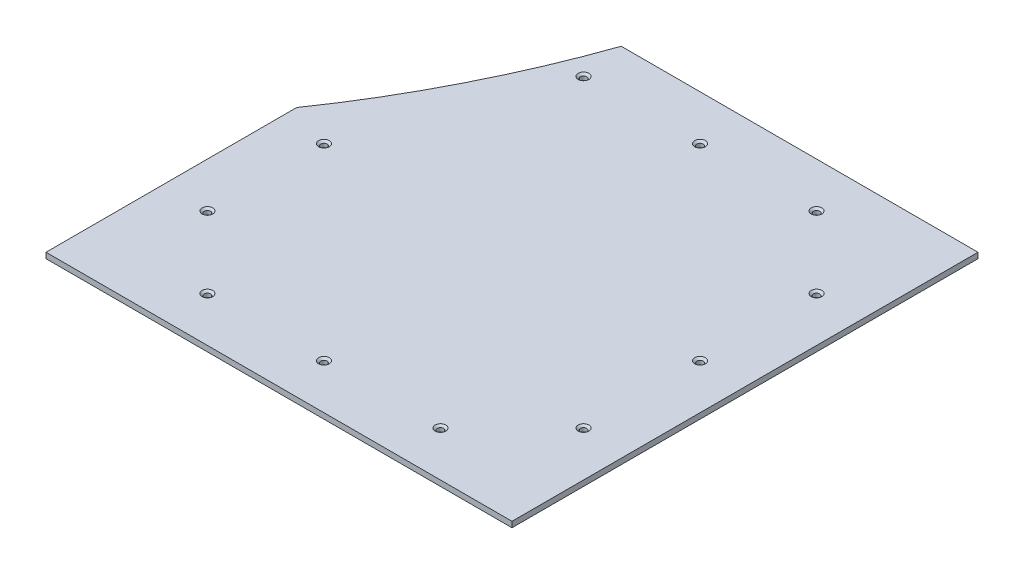
ISO-10303-21;
HEADER;
FILE_DESCRIPTION(('STEP AP214'),'2;1');
FILE_NAME('part.step','',(''),(''),'','','');
FILE_SCHEMA(('AUTOMOTIVE_DESIGN { 1 0 10303 214 1 1 1 1 }'));
ENDSEC;
DATA;
#1=APPLICATION_CONTEXT('core data for automotive mechanical design processes');
#2=APPLICATION_PROTOCOL_DEFINITION('international standard','automotive_design',2000,#1);
#3=PRODUCT_CONTEXT('',#1,'mechanical');
#4=PRODUCT('Part','Part','',(#3));
#5=PRODUCT_RELATED_PRODUCT_CATEGORY('part','',(#4));
#6=PRODUCT_DEFINITION_FORMATION('','',#4);
#7=PRODUCT_DEFINITION_CONTEXT('part definition',#1,'design');
#8=PRODUCT_DEFINITION('design','',#6,#7);
#9=PRODUCT_DEFINITION_SHAPE('','',#8);
#10=(LENGTH_UNIT() NAMED_UNIT(*) SI_UNIT(.MILLI.,.METRE.));
#11=(NAMED_UNIT(*) PLANE_ANGLE_UNIT() SI_UNIT($,.RADIAN.));
#12=(NAMED_UNIT(*) SI_UNIT($,.STERADIAN.) SOLID_ANGLE_UNIT());
#13=UNCERTAINTY_MEASURE_WITH_UNIT(LENGTH_MEASURE(1.E-05),#10,'distance_accuracy_value','');
#14=(GEOMETRIC_REPRESENTATION_CONTEXT(3) GLOBAL_UNCERTAINTY_ASSIGNED_CONTEXT((#13)) GLOBAL_UNIT_ASSIGNED_CONTEXT((#10,
#11,#12)) REPRESENTATION_CONTEXT('',''));
#15=CARTESIAN_POINT('',(0.,0.,0.));
#16=DIRECTION('',(0.,0.,1.));
#17=DIRECTION('',(1.,0.,0.));
#18=AXIS2_PLACEMENT_3D('',#15,#16,#17);
#19=CARTESIAN_POINT('',(65.821179,76.933679,65.821179));
#20=DIRECTION('',(1.,0.,0.));
#21=DIRECTION('',(0.,0.,1.));
#22=AXIS2_PLACEMENT_3D('',#19,#20,#21);
#23=PLANE('',#22);
#24=DIRECTION('',(0.,0.,1.));
#25=VECTOR('',#24,1.);
#26=CARTESIAN_POINT('',(65.821179,75.346179,65.821179));
#27=LINE('',#26,#25);
#28=CARTESIAN_POINT('',(65.821179,75.346179,-65.821179));
#29=VERTEX_POINT('',#28);
#30=CARTESIAN_POINT('',(65.821179,75.346179,65.821179));
#31=VERTEX_POINT('',#30);
#32=EDGE_CURVE('E103',#29,#31,#27,.T.);
#33=ORIENTED_EDGE('',*,*,#32,.F.);
#34=DIRECTION('',(0.,-1.,0.));
#35=VECTOR('',#34,1.);
#36=CARTESIAN_POINT('',(65.821179,76.933679,-65.821179));
#37=LINE('',#36,#35);
#38=CARTESIAN_POINT('',(65.821179,76.933679,-65.821179));
#39=VERTEX_POINT('',#38);
#40=EDGE_CURVE('E39',#39,#29,#37,.T.);
#41=ORIENTED_EDGE('',*,*,#40,.F.);
#42=DIRECTION('',(0.,0.,1.));
#43=VECTOR('',#42,1.);
#44=CARTESIAN_POINT('',(65.821179,76.933679,65.821179));
#45=LINE('',#44,#43);
#46=CARTESIAN_POINT('',(65.821179,76.933679,65.821179));
#47=VERTEX_POINT('',#46);
#48=EDGE_CURVE('E101',#39,#47,#45,.T.);
#49=ORIENTED_EDGE('',*,*,#48,.T.);
#50=DIRECTION('',(0.,-1.,0.));
#51=VECTOR('',#50,1.);
#52=CARTESIAN_POINT('',(65.821179,76.933679,65.821179));
#53=LINE('',#52,#51);
#54=EDGE_CURVE('E76',#47,#31,#53,.T.);
#55=ORIENTED_EDGE('',*,*,#54,.T.);
#56=EDGE_LOOP('',(#33,#41,#49,#55));
#57=FACE_BOUND('',#56,.T.);
#58=ADVANCED_FACE('F32',(#57),#23,.T.);
#59=CARTESIAN_POINT('',(65.821179,76.933679,-65.821179));
#60=DIRECTION('',(0.,0.,-1.));
#61=DIRECTION('',(1.,0.,0.));
#62=AXIS2_PLACEMENT_3D('',#59,#60,#61);
#63=PLANE('',#62);
#64=CARTESIAN_POINT('',(-82.3805879925049,72.1938508100711,-65.821179));
#65=DIRECTION('',(0.,0.,-1.));
#66=DIRECTION('',(-0.698196395740358,0.715906273876108,0.));
#67=AXIS2_PLACEMENT_3D('',#64,#65,#66);
#68=ELLIPSE('',#67,54.4366628705828,44.45);
#69=CARTESIAN_POINT('',(-34.97366248008,76.933679,-65.821179));
#70=VERTEX_POINT('',#69);
#71=CARTESIAN_POINT('',(-34.5349416414305,75.346179,-65.821179));
#72=VERTEX_POINT('',#71);
#73=EDGE_CURVE('E46',#70,#72,#68,.T.);
#74=ORIENTED_EDGE('',*,*,#73,.F.);
#75=DIRECTION('',(1.,0.,0.));
#76=VECTOR('',#75,1.);
#77=CARTESIAN_POINT('',(65.821179,76.933679,-65.821179));
#78=LINE('',#77,#76);
#79=EDGE_CURVE('E53',#70,#39,#78,.T.);
#80=ORIENTED_EDGE('',*,*,#79,.T.);
#81=ORIENTED_EDGE('',*,*,#40,.T.);
#82=DIRECTION('',(1.,0.,0.));
#83=VECTOR('',#82,1.);
#84=CARTESIAN_POINT('',(65.821179,75.346179,-65.821179));
#85=LINE('',#84,#83);
#86=EDGE_CURVE('E71',#72,#29,#85,.T.);
#87=ORIENTED_EDGE('',*,*,#86,.F.);
#88=EDGE_LOOP('',(#74,#80,#81,#87));
#89=FACE_BOUND('',#88,.T.);
#90=ADVANCED_FACE('F132',(#89),#63,.T.);
#91=CARTESIAN_POINT('',(-65.821179,76.933679,65.821179));
#92=DIRECTION('',(-1.,0.,0.));
#93=DIRECTION('',(0.,0.,-1.));
#94=AXIS2_PLACEMENT_3D('',#91,#92,#93);
#95=PLANE('',#94);
#96=CARTESIAN_POINT('',(-65.821179,55.2144094068485,-99.3686619114966));
#97=DIRECTION('',(-1.,0.,0.));
#98=DIRECTION('',(0.,0.451584874767388,0.892228166379723));
#99=AXIS2_PLACEMENT_3D('',#96,#97,#98);
#100=ELLIPSE('',#99,110.282499709764,44.45);
#101=CARTESIAN_POINT('',(-65.821179,75.346179,-5.93497246907813));
#102=VERTEX_POINT('',#101);
#103=CARTESIAN_POINT('',(-65.821179,76.933679,-4.99570311764791));
#104=VERTEX_POINT('',#103);
#105=EDGE_CURVE('E86',#102,#104,#100,.T.);
#106=ORIENTED_EDGE('',*,*,#105,.F.);
#107=DIRECTION('',(0.,0.,-1.));
#108=VECTOR('',#107,1.);
#109=CARTESIAN_POINT('',(-65.821179,75.346179,65.821179));
#110=LINE('',#109,#108);
#111=CARTESIAN_POINT('',(-65.821179,75.346179,65.821179));
#112=VERTEX_POINT('',#111);
#113=EDGE_CURVE('E93',#112,#102,#110,.T.);
#114=ORIENTED_EDGE('',*,*,#113,.F.);
#115=DIRECTION('',(0.,-1.,0.));
#116=VECTOR('',#115,1.);
#117=CARTESIAN_POINT('',(-65.821179,76.933679,65.821179));
#118=LINE('',#117,#116);
#119=CARTESIAN_POINT('',(-65.821179,76.933679,65.821179));
#120=VERTEX_POINT('',#119);
#121=EDGE_CURVE('E108',#120,#112,#118,.T.);
#122=ORIENTED_EDGE('',*,*,#121,.F.);
#123=DIRECTION('',(0.,0.,-1.));
#124=VECTOR('',#123,1.);
#125=CARTESIAN_POINT('',(-65.821179,76.933679,65.821179));
#126=LINE('',#125,#124);
#127=EDGE_CURVE('E96',#120,#104,#126,.T.);
#128=ORIENTED_EDGE('',*,*,#127,.T.);
#129=EDGE_LOOP('',(#106,#114,#122,#128));
#130=FACE_BOUND('',#129,.T.);
#131=ADVANCED_FACE('F92',(#130),#95,.T.);
#132=CARTESIAN_POINT('',(65.821179,76.933679,65.821179));
#133=DIRECTION('',(0.,0.,1.));
#134=DIRECTION('',(-1.,0.,0.));
#135=AXIS2_PLACEMENT_3D('',#132,#133,#134);
#136=PLANE('',#135);
#137=DIRECTION('',(-1.,0.,0.));
#138=VECTOR('',#137,1.);
#139=CARTESIAN_POINT('',(65.821179,75.346179,65.821179));
#140=LINE('',#139,#138);
#141=EDGE_CURVE('E99',#31,#112,#140,.T.);
#142=ORIENTED_EDGE('',*,*,#141,.F.);
#143=ORIENTED_EDGE('',*,*,#54,.F.);
#144=DIRECTION('',(-1.,0.,0.));
#145=VECTOR('',#144,1.);
#146=CARTESIAN_POINT('',(65.821179,76.933679,65.821179));
#147=LINE('',#146,#145);
#148=EDGE_CURVE('E113',#47,#120,#147,.T.);
#149=ORIENTED_EDGE('',*,*,#148,.T.);
#150=ORIENTED_EDGE('',*,*,#121,.T.);
#151=EDGE_LOOP('',(#142,#143,#149,#150));
#152=FACE_BOUND('',#151,.T.);
#153=ADVANCED_FACE('F127',(#152),#136,.T.);
#154=CARTESIAN_POINT('',(65.821179,76.933679,-65.821179));
#155=DIRECTION('',(0.,1.,0.));
#156=DIRECTION('',(0.,0.,-1.));
#157=AXIS2_PLACEMENT_3D('',#154,#155,#156);
#158=PLANE('',#157);
#159=CARTESIAN_POINT('',(-87.0031637114175,76.933679,-56.4563653156764));
#160=DIRECTION('',(0.,1.,0.));
#161=DIRECTION('',(-0.442624526559217,0.,0.896707047194472));
#162=AXIS2_PLACEMENT_3D('',#159,#160,#161);
#163=ELLIPSE('',#162,107.554363776842,44.45);
#164=EDGE_CURVE('E133',#104,#70,#163,.T.);
#165=ORIENTED_EDGE('',*,*,#164,.F.);
#166=ORIENTED_EDGE('',*,*,#127,.F.);
#167=ORIENTED_EDGE('',*,*,#148,.F.);
#168=ORIENTED_EDGE('',*,*,#48,.F.);
#169=ORIENTED_EDGE('',*,*,#79,.F.);
#170=EDGE_LOOP('',(#165,#166,#167,#168,#169));
#171=FACE_BOUND('',#170,.T.);
#172=CARTESIAN_POINT('',(-53.1211790000003,76.933679,32.9105894999995));
#173=DIRECTION('',(0.,1.,0.));
#174=DIRECTION('',(0.,0.,-1.));
#175=AXIS2_PLACEMENT_3D('',#172,#173,#174);
#176=CIRCLE('',#175,1.5113);
#177=CARTESIAN_POINT('',(-53.1211790000003,76.933679,31.3992894999995));
#178=VERTEX_POINT('',#177);
#179=EDGE_CURVE('E135',#178,#178,#176,.T.);
#180=ORIENTED_EDGE('',*,*,#179,.F.);
#181=EDGE_LOOP('',(#180));
#182=FACE_BOUND('',#181,.T.);
#183=CARTESIAN_POINT('',(-53.121179,76.933679,-5.54508773728232E-13));
#184=DIRECTION('',(0.,1.,0.));
#185=DIRECTION('',(0.,0.,-1.));
#186=AXIS2_PLACEMENT_3D('',#183,#184,#185);
#187=CIRCLE('',#186,1.5113);
#188=CARTESIAN_POINT('',(-53.121179,76.933679,-1.51130000000055));
#189=VERTEX_POINT('',#188);
#190=EDGE_CURVE('E146',#189,#189,#187,.T.);
#191=ORIENTED_EDGE('',*,*,#190,.F.);
#192=EDGE_LOOP('',(#191));
#193=FACE_BOUND('',#192,.T.);
#194=CARTESIAN_POINT('',(32.9105894999996,76.933679,53.1211790000002));
#195=DIRECTION('',(0.,1.,0.));
#196=DIRECTION('',(0.,0.,-1.));
#197=AXIS2_PLACEMENT_3D('',#194,#195,#196);
#198=CIRCLE('',#197,1.5113);
#199=CARTESIAN_POINT('',(32.9105894999996,76.933679,51.6098790000002));
#200=VERTEX_POINT('',#199);
#201=EDGE_CURVE('E155',#200,#200,#198,.T.);
#202=ORIENTED_EDGE('',*,*,#201,.F.);
#203=EDGE_LOOP('',(#202));
#204=FACE_BOUND('',#203,.T.);
#205=CARTESIAN_POINT('',(-3.69037061127219E-13,76.933679,53.121179));
#206=DIRECTION('',(0.,1.,0.));
#207=DIRECTION('',(0.,0.,-1.));
#208=AXIS2_PLACEMENT_3D('',#205,#206,#207);
#209=CIRCLE('',#208,1.5113);
#210=CARTESIAN_POINT('',(-3.69037061127219E-13,76.933679,51.609879));
#211=VERTEX_POINT('',#210);
#212=EDGE_CURVE('E164',#211,#211,#209,.T.);
#213=ORIENTED_EDGE('',*,*,#212,.F.);
#214=EDGE_LOOP('',(#213));
#215=FACE_BOUND('',#214,.T.);
#216=CARTESIAN_POINT('',(-32.9105895000004,76.933679,53.1211789999997));
#217=DIRECTION('',(0.,1.,0.));
#218=DIRECTION('',(0.,0.,-1.));
#219=AXIS2_PLACEMENT_3D('',#216,#217,#218);
#220=CIRCLE('',#219,1.5113);
#221=CARTESIAN_POINT('',(-32.9105895000004,76.933679,51.6098789999997));
#222=VERTEX_POINT('',#221);
#223=EDGE_CURVE('E173',#222,#222,#220,.T.);
#224=ORIENTED_EDGE('',*,*,#223,.F.);
#225=EDGE_LOOP('',(#224));
#226=FACE_BOUND('',#225,.T.);
#227=CARTESIAN_POINT('',(53.1211790000001,76.933679,-32.9105894999998));
#228=DIRECTION('',(0.,1.,0.));
#229=DIRECTION('',(0.,0.,-1.));
#230=AXIS2_PLACEMENT_3D('',#227,#228,#229);
#231=CIRCLE('',#230,1.5113);
#232=CARTESIAN_POINT('',(53.1211790000001,76.933679,-34.4218894999998));
#233=VERTEX_POINT('',#232);
#234=EDGE_CURVE('E182',#233,#233,#231,.T.);
#235=ORIENTED_EDGE('',*,*,#234,.F.);
#236=EDGE_LOOP('',(#235));
#237=FACE_BOUND('',#236,.T.);
#238=CARTESIAN_POINT('',(53.121179,76.933679,1.83565348526206E-13));
#239=DIRECTION('',(0.,1.,0.));
#240=DIRECTION('',(0.,0.,-1.));
#241=AXIS2_PLACEMENT_3D('',#238,#239,#240);
#242=CIRCLE('',#241,1.5113);
#243=CARTESIAN_POINT('',(53.121179,76.933679,-1.51129999999982));
#244=VERTEX_POINT('',#243);
#245=EDGE_CURVE('E191',#244,#244,#242,.T.);
#246=ORIENTED_EDGE('',*,*,#245,.F.);
#247=EDGE_LOOP('',(#246));
#248=FACE_BOUND('',#247,.T.);
#249=CARTESIAN_POINT('',(53.1211789999998,76.933679,32.9105895000002));
#250=DIRECTION('',(0.,1.,0.));
#251=DIRECTION('',(0.,0.,-1.));
#252=AXIS2_PLACEMENT_3D('',#249,#250,#251);
#253=CIRCLE('',#252,1.5113);
#254=CARTESIAN_POINT('',(53.1211789999998,76.933679,31.3992895000002));
#255=VERTEX_POINT('',#254);
#256=EDGE_CURVE('E200',#255,#255,#253,.T.);
#257=ORIENTED_EDGE('',*,*,#256,.F.);
#258=EDGE_LOOP('',(#257));
#259=FACE_BOUND('',#258,.T.);
#260=CARTESIAN_POINT('',(-32.9105895,76.933679,-53.121179));
#261=DIRECTION('',(0.,1.,0.));
#262=DIRECTION('',(0.,0.,-1.));
#263=AXIS2_PLACEMENT_3D('',#260,#261,#262);
#264=CIRCLE('',#263,1.5113);
#265=CARTESIAN_POINT('',(-32.9105895,76.933679,-54.632479));
#266=VERTEX_POINT('',#265);
#267=EDGE_CURVE('E209',#266,#266,#264,.T.);
#268=ORIENTED_EDGE('',*,*,#267,.F.);
#269=EDGE_LOOP('',(#268));
#270=FACE_BOUND('',#269,.T.);
#271=CARTESIAN_POINT('',(0.,76.933679,-53.121179));
#272=DIRECTION('',(0.,1.,0.));
#273=DIRECTION('',(0.,0.,-1.));
#274=AXIS2_PLACEMENT_3D('',#271,#272,#273);
#275=CIRCLE('',#274,1.5113);
#276=CARTESIAN_POINT('',(0.,76.933679,-54.632479));
#277=VERTEX_POINT('',#276);
#278=EDGE_CURVE('E218',#277,#277,#275,.T.);
#279=ORIENTED_EDGE('',*,*,#278,.F.);
#280=EDGE_LOOP('',(#279));
#281=FACE_BOUND('',#280,.T.);
#282=CARTESIAN_POINT('',(32.9105895,76.933679,-53.121179));
#283=DIRECTION('',(0.,1.,0.));
#284=DIRECTION('',(0.,0.,-1.));
#285=AXIS2_PLACEMENT_3D('',#282,#283,#284);
#286=CIRCLE('',#285,1.5113);
#287=CARTESIAN_POINT('',(32.9105895,76.933679,-54.632479));
#288=VERTEX_POINT('',#287);
#289=EDGE_CURVE('E123',#288,#288,#286,.T.);
#290=ORIENTED_EDGE('',*,*,#289,.F.);
#291=EDGE_LOOP('',(#290));
#292=FACE_BOUND('',#291,.T.);
#293=ADVANCED_FACE('F130',(#171,#182,#193,#204,#215,#226,#237,#248,#259,#270,#281,#292),#158,.T.);
#294=CARTESIAN_POINT('',(65.821179,75.346179,-65.821179));
#295=DIRECTION('',(0.,1.,0.));
#296=DIRECTION('',(0.,0.,-1.));
#297=AXIS2_PLACEMENT_3D('',#294,#295,#296);
#298=PLANE('',#297);
#299=CARTESIAN_POINT('',(-53.1211790000003,75.346179,32.9105894999995));
#300=DIRECTION('',(0.,1.,0.));
#301=DIRECTION('',(0.,0.,-1.));
#302=AXIS2_PLACEMENT_3D('',#299,#300,#301);
#303=CIRCLE('',#302,0.889000000000001);
#304=CARTESIAN_POINT('',(-53.1211790000003,75.346179,32.0215894999995));
#305=VERTEX_POINT('',#304);
#306=EDGE_CURVE('E143',#305,#305,#303,.T.);
#307=ORIENTED_EDGE('',*,*,#306,.T.);
#308=EDGE_LOOP('',(#307));
#309=FACE_BOUND('',#308,.T.);
#310=CARTESIAN_POINT('',(-53.121179,75.346179,-5.54508773728232E-13));
#311=DIRECTION('',(0.,1.,0.));
#312=DIRECTION('',(0.,0.,-1.));
#313=AXIS2_PLACEMENT_3D('',#310,#311,#312);
#314=CIRCLE('',#313,0.889000000000001);
#315=CARTESIAN_POINT('',(-53.121179,75.346179,-0.889000000000556));
#316=VERTEX_POINT('',#315);
#317=EDGE_CURVE('E152',#316,#316,#314,.T.);
#318=ORIENTED_EDGE('',*,*,#317,.T.);
#319=EDGE_LOOP('',(#318));
#320=FACE_BOUND('',#319,.T.);
#321=CARTESIAN_POINT('',(32.9105894999996,75.346179,53.1211790000002));
#322=DIRECTION('',(0.,1.,0.));
#323=DIRECTION('',(0.,0.,-1.));
#324=AXIS2_PLACEMENT_3D('',#321,#322,#323);
#325=CIRCLE('',#324,0.889000000000001);
#326=CARTESIAN_POINT('',(32.9105894999996,75.346179,52.2321790000002));
#327=VERTEX_POINT('',#326);
#328=EDGE_CURVE('E161',#327,#327,#325,.T.);
#329=ORIENTED_EDGE('',*,*,#328,.T.);
#330=EDGE_LOOP('',(#329));
#331=FACE_BOUND('',#330,.T.);
#332=CARTESIAN_POINT('',(-3.69037061127219E-13,75.346179,53.121179));
#333=DIRECTION('',(0.,1.,0.));
#334=DIRECTION('',(0.,0.,-1.));
#335=AXIS2_PLACEMENT_3D('',#332,#333,#334);
#336=CIRCLE('',#335,0.889);
#337=CARTESIAN_POINT('',(-3.69037061127219E-13,75.346179,52.232179));
#338=VERTEX_POINT('',#337);
#339=EDGE_CURVE('E170',#338,#338,#336,.T.);
#340=ORIENTED_EDGE('',*,*,#339,.T.);
#341=EDGE_LOOP('',(#340));
#342=FACE_BOUND('',#341,.T.);
#343=CARTESIAN_POINT('',(-32.9105895000004,75.346179,53.1211789999997));
#344=DIRECTION('',(0.,1.,0.));
#345=DIRECTION('',(0.,0.,-1.));
#346=AXIS2_PLACEMENT_3D('',#343,#344,#345);
#347=CIRCLE('',#346,0.889000000000001);
#348=CARTESIAN_POINT('',(-32.9105895000004,75.346179,52.2321789999997));
#349=VERTEX_POINT('',#348);
#350=EDGE_CURVE('E179',#349,#349,#347,.T.);
#351=ORIENTED_EDGE('',*,*,#350,.T.);
#352=EDGE_LOOP('',(#351));
#353=FACE_BOUND('',#352,.T.);
#354=CARTESIAN_POINT('',(53.1211790000001,75.346179,-32.9105894999998));
#355=DIRECTION('',(0.,1.,0.));
#356=DIRECTION('',(0.,0.,-1.));
#357=AXIS2_PLACEMENT_3D('',#354,#355,#356);
#358=CIRCLE('',#357,0.889000000000001);
#359=CARTESIAN_POINT('',(53.1211790000001,75.346179,-33.7995894999998));
#360=VERTEX_POINT('',#359);
#361=EDGE_CURVE('E188',#360,#360,#358,.T.);
#362=ORIENTED_EDGE('',*,*,#361,.T.);
#363=EDGE_LOOP('',(#362));
#364=FACE_BOUND('',#363,.T.);
#365=CARTESIAN_POINT('',(53.121179,75.346179,1.83565348526206E-13));
#366=DIRECTION('',(0.,1.,0.));
#367=DIRECTION('',(0.,0.,-1.));
#368=AXIS2_PLACEMENT_3D('',#365,#366,#367);
#369=CIRCLE('',#368,0.889000000000001);
#370=CARTESIAN_POINT('',(53.121179,75.346179,-0.888999999999818));
#371=VERTEX_POINT('',#370);
#372=EDGE_CURVE('E197',#371,#371,#369,.T.);
#373=ORIENTED_EDGE('',*,*,#372,.T.);
#374=EDGE_LOOP('',(#373));
#375=FACE_BOUND('',#374,.T.);
#376=CARTESIAN_POINT('',(53.1211789999998,75.346179,32.9105895000002));
#377=DIRECTION('',(0.,1.,0.));
#378=DIRECTION('',(0.,0.,-1.));
#379=AXIS2_PLACEMENT_3D('',#376,#377,#378);
#380=CIRCLE('',#379,0.889000000000001);
#381=CARTESIAN_POINT('',(53.1211789999998,75.346179,32.0215895000002));
#382=VERTEX_POINT('',#381);
#383=EDGE_CURVE('E206',#382,#382,#380,.T.);
#384=ORIENTED_EDGE('',*,*,#383,.T.);
#385=EDGE_LOOP('',(#384));
#386=FACE_BOUND('',#385,.T.);
#387=CARTESIAN_POINT('',(-32.9105895,75.346179,-53.121179));
#388=DIRECTION('',(0.,1.,0.));
#389=DIRECTION('',(0.,0.,-1.));
#390=AXIS2_PLACEMENT_3D('',#387,#388,#389);
#391=CIRCLE('',#390,0.889000000000001);
#392=CARTESIAN_POINT('',(-32.9105895,75.346179,-54.010179));
#393=VERTEX_POINT('',#392);
#394=EDGE_CURVE('E215',#393,#393,#391,.T.);
#395=ORIENTED_EDGE('',*,*,#394,.T.);
#396=EDGE_LOOP('',(#395));
#397=FACE_BOUND('',#396,.T.);
#398=CARTESIAN_POINT('',(0.,75.346179,-53.121179));
#399=DIRECTION('',(0.,1.,0.));
#400=DIRECTION('',(0.,0.,-1.));
#401=AXIS2_PLACEMENT_3D('',#398,#399,#400);
#402=CIRCLE('',#401,0.889);
#403=CARTESIAN_POINT('',(0.,75.346179,-54.010179));
#404=VERTEX_POINT('',#403);
#405=EDGE_CURVE('E224',#404,#404,#402,.T.);
#406=ORIENTED_EDGE('',*,*,#405,.T.);
#407=EDGE_LOOP('',(#406));
#408=FACE_BOUND('',#407,.T.);
#409=CARTESIAN_POINT('',(32.9105895,75.346179,-53.121179));
#410=DIRECTION('',(0.,1.,0.));
#411=DIRECTION('',(0.,0.,-1.));
#412=AXIS2_PLACEMENT_3D('',#409,#410,#411);
#413=CIRCLE('',#412,0.889000000000001);
#414=CARTESIAN_POINT('',(32.9105895,75.346179,-54.010179));
#415=VERTEX_POINT('',#414);
#416=EDGE_CURVE('E116',#415,#415,#413,.T.);
#417=ORIENTED_EDGE('',*,*,#416,.T.);
#418=EDGE_LOOP('',(#417));
#419=FACE_BOUND('',#418,.T.);
#420=ORIENTED_EDGE('',*,*,#113,.T.);
#421=CARTESIAN_POINT('',(-85.4549348179386,75.346179,-59.5929013098401));
#422=DIRECTION('',(0.,1.,0.));
#423=DIRECTION('',(-0.442624526559217,0.,0.896707047194472));
#424=AXIS2_PLACEMENT_3D('',#421,#422,#423);
#425=ELLIPSE('',#424,107.554363776842,44.45);
#426=EDGE_CURVE('E11',#102,#72,#425,.T.);
#427=ORIENTED_EDGE('',*,*,#426,.T.);
#428=ORIENTED_EDGE('',*,*,#86,.T.);
#429=ORIENTED_EDGE('',*,*,#32,.T.);
#430=ORIENTED_EDGE('',*,*,#141,.T.);
#431=EDGE_LOOP('',(#420,#427,#428,#429,#430));
#432=FACE_BOUND('',#431,.T.);
#433=ADVANCED_FACE('F98',(#309,#320,#331,#342,#353,#364,#375,#386,#397,#408,#419,#432),#298,.F.);
#434=CARTESIAN_POINT('',(32.9105895,76.933679,-53.121179));
#435=DIRECTION('',(0.,1.,0.));
#436=DIRECTION('',(0.,0.,-1.));
#437=AXIS2_PLACEMENT_3D('',#434,#435,#436);
#438=CYLINDRICAL_SURFACE('',#437,0.888999999999997);
#439=ORIENTED_EDGE('',*,*,#416,.F.);
#440=EDGE_LOOP('',(#439));
#441=FACE_BOUND('',#440,.T.);
#442=CARTESIAN_POINT('',(32.9105895,76.4115072995184,-53.121179));
#443=DIRECTION('',(0.,1.,0.));
#444=DIRECTION('',(0.,0.,-1.));
#445=AXIS2_PLACEMENT_3D('',#442,#443,#444);
#446=CIRCLE('',#445,0.888999999999994);
#447=CARTESIAN_POINT('',(32.9105895,76.4115072995184,-54.010179));
#448=VERTEX_POINT('',#447);
#449=EDGE_CURVE('E118',#448,#448,#446,.T.);
#450=ORIENTED_EDGE('',*,*,#449,.T.);
#451=EDGE_LOOP('',(#450));
#452=FACE_BOUND('',#451,.T.);
#453=ADVANCED_FACE('F237',(#441,#452),#438,.F.);
#454=CARTESIAN_POINT('',(32.9105895,76.933679,-53.121179));
#455=DIRECTION('',(0.,1.,0.));
#456=DIRECTION('',(0.,0.,-1.));
#457=AXIS2_PLACEMENT_3D('',#454,#455,#456);
#458=CONICAL_SURFACE('',#457,1.5113,0.872664625997172);
#459=ORIENTED_EDGE('',*,*,#449,.F.);
#460=EDGE_LOOP('',(#459));
#461=FACE_BOUND('',#460,.T.);
#462=ORIENTED_EDGE('',*,*,#289,.T.);
#463=EDGE_LOOP('',(#462));
#464=FACE_BOUND('',#463,.T.);
#465=ADVANCED_FACE('F229',(#461,#464),#458,.F.);
#466=CARTESIAN_POINT('',(0.,76.933679,-53.121179));
#467=DIRECTION('',(0.,1.,0.));
#468=DIRECTION('',(0.,0.,-1.));
#469=AXIS2_PLACEMENT_3D('',#466,#467,#468);
#470=CYLINDRICAL_SURFACE('',#469,0.888999999999998);
#471=ORIENTED_EDGE('',*,*,#405,.F.);
#472=EDGE_LOOP('',(#471));
#473=FACE_BOUND('',#472,.T.);
#474=CARTESIAN_POINT('',(0.,76.4115072995184,-53.121179));
#475=DIRECTION('',(0.,1.,0.));
#476=DIRECTION('',(0.,0.,-1.));
#477=AXIS2_PLACEMENT_3D('',#474,#475,#476);
#478=CIRCLE('',#477,0.888999999999997);
#479=CARTESIAN_POINT('',(0.,76.4115072995184,-54.010179));
#480=VERTEX_POINT('',#479);
#481=EDGE_CURVE('E221',#480,#480,#478,.T.);
#482=ORIENTED_EDGE('',*,*,#481,.T.);
#483=EDGE_LOOP('',(#482));
#484=FACE_BOUND('',#483,.T.);
#485=ADVANCED_FACE('F277',(#473,#484),#470,.F.);
#486=CARTESIAN_POINT('',(0.,76.933679,-53.121179));
#487=DIRECTION('',(0.,1.,0.));
#488=DIRECTION('',(0.,0.,-1.));
#489=AXIS2_PLACEMENT_3D('',#486,#487,#488);
#490=CONICAL_SURFACE('',#489,1.5113,0.87266462599717);
#491=ORIENTED_EDGE('',*,*,#481,.F.);
#492=EDGE_LOOP('',(#491));
#493=FACE_BOUND('',#492,.T.);
#494=ORIENTED_EDGE('',*,*,#278,.T.);
#495=EDGE_LOOP('',(#494));
#496=FACE_BOUND('',#495,.T.);
#497=ADVANCED_FACE('F287',(#493,#496),#490,.F.);
#498=CARTESIAN_POINT('',(-32.9105895,76.933679,-53.121179));
#499=DIRECTION('',(0.,1.,0.));
#500=DIRECTION('',(0.,0.,-1.));
#501=AXIS2_PLACEMENT_3D('',#498,#499,#500);
#502=CYLINDRICAL_SURFACE('',#501,0.888999999999997);
#503=ORIENTED_EDGE('',*,*,#394,.F.);
#504=EDGE_LOOP('',(#503));
#505=FACE_BOUND('',#504,.T.);
#506=CARTESIAN_POINT('',(-32.9105895,76.4115072995184,-53.121179));
#507=DIRECTION('',(0.,1.,0.));
#508=DIRECTION('',(0.,0.,-1.));
#509=AXIS2_PLACEMENT_3D('',#506,#507,#508);
#510=CIRCLE('',#509,0.888999999999994);
#511=CARTESIAN_POINT('',(-32.9105895,76.4115072995184,-54.010179));
#512=VERTEX_POINT('',#511);
#513=EDGE_CURVE('E212',#512,#512,#510,.T.);
#514=ORIENTED_EDGE('',*,*,#513,.T.);
#515=EDGE_LOOP('',(#514));
#516=FACE_BOUND('',#515,.T.);
#517=ADVANCED_FACE('F297',(#505,#516),#502,.F.);
#518=CARTESIAN_POINT('',(-32.9105895,76.933679,-53.121179));
#519=DIRECTION('',(0.,1.,0.));
#520=DIRECTION('',(0.,0.,-1.));
#521=AXIS2_PLACEMENT_3D('',#518,#519,#520);
#522=CONICAL_SURFACE('',#521,1.5113,0.872664625997172);
#523=ORIENTED_EDGE('',*,*,#513,.F.);
#524=EDGE_LOOP('',(#523));
#525=FACE_BOUND('',#524,.T.);
#526=ORIENTED_EDGE('',*,*,#267,.T.);
#527=EDGE_LOOP('',(#526));
#528=FACE_BOUND('',#527,.T.);
#529=ADVANCED_FACE('F307',(#525,#528),#522,.F.);
#530=CARTESIAN_POINT('',(53.1211789999998,76.933679,32.9105895000002));
#531=DIRECTION('',(0.,1.,0.));
#532=DIRECTION('',(0.,0.,-1.));
#533=AXIS2_PLACEMENT_3D('',#530,#531,#532);
#534=CYLINDRICAL_SURFACE('',#533,0.888999999999997);
#535=ORIENTED_EDGE('',*,*,#383,.F.);
#536=EDGE_LOOP('',(#535));
#537=FACE_BOUND('',#536,.T.);
#538=CARTESIAN_POINT('',(53.1211789999998,76.4115072995184,32.9105895000002));
#539=DIRECTION('',(0.,1.,0.));
#540=DIRECTION('',(0.,0.,-1.));
#541=AXIS2_PLACEMENT_3D('',#538,#539,#540);
#542=CIRCLE('',#541,0.888999999999994);
#543=CARTESIAN_POINT('',(53.1211789999998,76.4115072995184,32.0215895000002));
#544=VERTEX_POINT('',#543);
#545=EDGE_CURVE('E203',#544,#544,#542,.T.);
#546=ORIENTED_EDGE('',*,*,#545,.T.);
#547=EDGE_LOOP('',(#546));
#548=FACE_BOUND('',#547,.T.);
#549=ADVANCED_FACE('F317',(#537,#548),#534,.F.);
#550=CARTESIAN_POINT('',(53.1211789999998,76.933679,32.9105895000002));
#551=DIRECTION('',(0.,1.,0.));
#552=DIRECTION('',(0.,0.,-1.));
#553=AXIS2_PLACEMENT_3D('',#550,#551,#552);
#554=CONICAL_SURFACE('',#553,1.5113,0.872664625997172);
#555=ORIENTED_EDGE('',*,*,#545,.F.);
#556=EDGE_LOOP('',(#555));
#557=FACE_BOUND('',#556,.T.);
#558=ORIENTED_EDGE('',*,*,#256,.T.);
#559=EDGE_LOOP('',(#558));
#560=FACE_BOUND('',#559,.T.);
#561=ADVANCED_FACE('F327',(#557,#560),#554,.F.);
#562=CARTESIAN_POINT('',(53.121179,76.933679,1.83565348526206E-13));
#563=DIRECTION('',(0.,1.,0.));
#564=DIRECTION('',(0.,0.,-1.));
#565=AXIS2_PLACEMENT_3D('',#562,#563,#564);
#566=CYLINDRICAL_SURFACE('',#565,0.888999999999997);
#567=ORIENTED_EDGE('',*,*,#372,.F.);
#568=EDGE_LOOP('',(#567));
#569=FACE_BOUND('',#568,.T.);
#570=CARTESIAN_POINT('',(53.121179,76.4115072995184,1.83565348526206E-13));
#571=DIRECTION('',(0.,1.,0.));
#572=DIRECTION('',(0.,0.,-1.));
#573=AXIS2_PLACEMENT_3D('',#570,#571,#572);
#574=CIRCLE('',#573,0.888999999999994);
#575=CARTESIAN_POINT('',(53.121179,76.4115072995184,-0.888999999999811));
#576=VERTEX_POINT('',#575);
#577=EDGE_CURVE('E194',#576,#576,#574,.T.);
#578=ORIENTED_EDGE('',*,*,#577,.T.);
#579=EDGE_LOOP('',(#578));
#580=FACE_BOUND('',#579,.T.);
#581=ADVANCED_FACE('F337',(#569,#580),#566,.F.);
#582=CARTESIAN_POINT('',(53.121179,76.933679,1.83565348526206E-13));
#583=DIRECTION('',(0.,1.,0.));
#584=DIRECTION('',(0.,0.,-1.));
#585=AXIS2_PLACEMENT_3D('',#582,#583,#584);
#586=CONICAL_SURFACE('',#585,1.5113,0.872664625997172);
#587=ORIENTED_EDGE('',*,*,#577,.F.);
#588=EDGE_LOOP('',(#587));
#589=FACE_BOUND('',#588,.T.);
#590=ORIENTED_EDGE('',*,*,#245,.T.);
#591=EDGE_LOOP('',(#590));
#592=FACE_BOUND('',#591,.T.);
#593=ADVANCED_FACE('F347',(#589,#592),#586,.F.);
#594=CARTESIAN_POINT('',(53.1211790000001,76.933679,-32.9105894999998));
#595=DIRECTION('',(0.,1.,0.));
#596=DIRECTION('',(0.,0.,-1.));
#597=AXIS2_PLACEMENT_3D('',#594,#595,#596);
#598=CYLINDRICAL_SURFACE('',#597,0.888999999999997);
#599=ORIENTED_EDGE('',*,*,#361,.F.);
#600=EDGE_LOOP('',(#599));
#601=FACE_BOUND('',#600,.T.);
#602=CARTESIAN_POINT('',(53.1211790000001,76.4115072995184,-32.9105894999998));
#603=DIRECTION('',(0.,1.,0.));
#604=DIRECTION('',(0.,0.,-1.));
#605=AXIS2_PLACEMENT_3D('',#602,#603,#604);
#606=CIRCLE('',#605,0.888999999999994);
#607=CARTESIAN_POINT('',(53.1211790000001,76.4115072995184,-33.7995894999998));
#608=VERTEX_POINT('',#607);
#609=EDGE_CURVE('E185',#608,#608,#606,.T.);
#610=ORIENTED_EDGE('',*,*,#609,.T.);
#611=EDGE_LOOP('',(#610));
#612=FACE_BOUND('',#611,.T.);
#613=ADVANCED_FACE('F357',(#601,#612),#598,.F.);
#614=CARTESIAN_POINT('',(53.1211790000001,76.933679,-32.9105894999998));
#615=DIRECTION('',(0.,1.,0.));
#616=DIRECTION('',(0.,0.,-1.));
#617=AXIS2_PLACEMENT_3D('',#614,#615,#616);
#618=CONICAL_SURFACE('',#617,1.5113,0.872664625997172);
#619=ORIENTED_EDGE('',*,*,#609,.F.);
#620=EDGE_LOOP('',(#619));
#621=FACE_BOUND('',#620,.T.);
#622=ORIENTED_EDGE('',*,*,#234,.T.);
#623=EDGE_LOOP('',(#622));
#624=FACE_BOUND('',#623,.T.);
#625=ADVANCED_FACE('F367',(#621,#624),#618,.F.);
#626=CARTESIAN_POINT('',(-32.9105895000004,76.933679,53.1211789999997));
#627=DIRECTION('',(0.,1.,0.));
#628=DIRECTION('',(0.,0.,-1.));
#629=AXIS2_PLACEMENT_3D('',#626,#627,#628);
#630=CYLINDRICAL_SURFACE('',#629,0.888999999999997);
#631=ORIENTED_EDGE('',*,*,#350,.F.);
#632=EDGE_LOOP('',(#631));
#633=FACE_BOUND('',#632,.T.);
#634=CARTESIAN_POINT('',(-32.9105895000004,76.4115072995184,53.1211789999997));
#635=DIRECTION('',(0.,1.,0.));
#636=DIRECTION('',(0.,0.,-1.));
#637=AXIS2_PLACEMENT_3D('',#634,#635,#636);
#638=CIRCLE('',#637,0.888999999999994);
#639=CARTESIAN_POINT('',(-32.9105895000004,76.4115072995184,52.2321789999997));
#640=VERTEX_POINT('',#639);
#641=EDGE_CURVE('E176',#640,#640,#638,.T.);
#642=ORIENTED_EDGE('',*,*,#641,.T.);
#643=EDGE_LOOP('',(#642));
#644=FACE_BOUND('',#643,.T.);
#645=ADVANCED_FACE('F377',(#633,#644),#630,.F.);
#646=CARTESIAN_POINT('',(-32.9105895000004,76.933679,53.1211789999997));
#647=DIRECTION('',(0.,1.,0.));
#648=DIRECTION('',(0.,0.,-1.));
#649=AXIS2_PLACEMENT_3D('',#646,#647,#648);
#650=CONICAL_SURFACE('',#649,1.5113,0.872664625997172);
#651=ORIENTED_EDGE('',*,*,#641,.F.);
#652=EDGE_LOOP('',(#651));
#653=FACE_BOUND('',#652,.T.);
#654=ORIENTED_EDGE('',*,*,#223,.T.);
#655=EDGE_LOOP('',(#654));
#656=FACE_BOUND('',#655,.T.);
#657=ADVANCED_FACE('F387',(#653,#656),#650,.F.);
#658=CARTESIAN_POINT('',(-3.69037061127219E-13,76.933679,53.121179));
#659=DIRECTION('',(0.,1.,0.));
#660=DIRECTION('',(0.,0.,-1.));
#661=AXIS2_PLACEMENT_3D('',#658,#659,#660);
#662=CYLINDRICAL_SURFACE('',#661,0.888999999999998);
#663=ORIENTED_EDGE('',*,*,#339,.F.);
#664=EDGE_LOOP('',(#663));
#665=FACE_BOUND('',#664,.T.);
#666=CARTESIAN_POINT('',(-3.69037061127219E-13,76.4115072995184,53.121179));
#667=DIRECTION('',(0.,1.,0.));
#668=DIRECTION('',(0.,0.,-1.));
#669=AXIS2_PLACEMENT_3D('',#666,#667,#668);
#670=CIRCLE('',#669,0.888999999999997);
#671=CARTESIAN_POINT('',(-3.69037061127219E-13,76.4115072995184,52.232179));
#672=VERTEX_POINT('',#671);
#673=EDGE_CURVE('E167',#672,#672,#670,.T.);
#674=ORIENTED_EDGE('',*,*,#673,.T.);
#675=EDGE_LOOP('',(#674));
#676=FACE_BOUND('',#675,.T.);
#677=ADVANCED_FACE('F397',(#665,#676),#662,.F.);
#678=CARTESIAN_POINT('',(-3.69037061127219E-13,76.933679,53.121179));
#679=DIRECTION('',(0.,1.,0.));
#680=DIRECTION('',(0.,0.,-1.));
#681=AXIS2_PLACEMENT_3D('',#678,#679,#680);
#682=CONICAL_SURFACE('',#681,1.5113,0.87266462599717);
#683=ORIENTED_EDGE('',*,*,#673,.F.);
#684=EDGE_LOOP('',(#683));
#685=FACE_BOUND('',#684,.T.);
#686=ORIENTED_EDGE('',*,*,#212,.T.);
#687=EDGE_LOOP('',(#686));
#688=FACE_BOUND('',#687,.T.);
#689=ADVANCED_FACE('F407',(#685,#688),#682,.F.);
#690=CARTESIAN_POINT('',(32.9105894999996,76.933679,53.1211790000002));
#691=DIRECTION('',(0.,1.,0.));
#692=DIRECTION('',(0.,0.,-1.));
#693=AXIS2_PLACEMENT_3D('',#690,#691,#692);
#694=CYLINDRICAL_SURFACE('',#693,0.888999999999997);
#695=ORIENTED_EDGE('',*,*,#328,.F.);
#696=EDGE_LOOP('',(#695));
#697=FACE_BOUND('',#696,.T.);
#698=CARTESIAN_POINT('',(32.9105894999996,76.4115072995184,53.1211790000002));
#699=DIRECTION('',(0.,1.,0.));
#700=DIRECTION('',(0.,0.,-1.));
#701=AXIS2_PLACEMENT_3D('',#698,#699,#700);
#702=CIRCLE('',#701,0.888999999999994);
#703=CARTESIAN_POINT('',(32.9105894999996,76.4115072995184,52.2321790000002));
#704=VERTEX_POINT('',#703);
#705=EDGE_CURVE('E158',#704,#704,#702,.T.);
#706=ORIENTED_EDGE('',*,*,#705,.T.);
#707=EDGE_LOOP('',(#706));
#708=FACE_BOUND('',#707,.T.);
#709=ADVANCED_FACE('F417',(#697,#708),#694,.F.);
#710=CARTESIAN_POINT('',(32.9105894999996,76.933679,53.1211790000002));
#711=DIRECTION('',(0.,1.,0.));
#712=DIRECTION('',(0.,0.,-1.));
#713=AXIS2_PLACEMENT_3D('',#710,#711,#712);
#714=CONICAL_SURFACE('',#713,1.5113,0.872664625997172);
#715=ORIENTED_EDGE('',*,*,#705,.F.);
#716=EDGE_LOOP('',(#715));
#717=FACE_BOUND('',#716,.T.);
#718=ORIENTED_EDGE('',*,*,#201,.T.);
#719=EDGE_LOOP('',(#718));
#720=FACE_BOUND('',#719,.T.);
#721=ADVANCED_FACE('F427',(#717,#720),#714,.F.);
#722=CARTESIAN_POINT('',(-53.121179,76.933679,-5.54508773728232E-13));
#723=DIRECTION('',(0.,1.,0.));
#724=DIRECTION('',(0.,0.,-1.));
#725=AXIS2_PLACEMENT_3D('',#722,#723,#724);
#726=CYLINDRICAL_SURFACE('',#725,0.888999999999997);
#727=ORIENTED_EDGE('',*,*,#317,.F.);
#728=EDGE_LOOP('',(#727));
#729=FACE_BOUND('',#728,.T.);
#730=CARTESIAN_POINT('',(-53.121179,76.4115072995184,-5.54508773728232E-13));
#731=DIRECTION('',(0.,1.,0.));
#732=DIRECTION('',(0.,0.,-1.));
#733=AXIS2_PLACEMENT_3D('',#730,#731,#732);
#734=CIRCLE('',#733,0.888999999999994);
#735=CARTESIAN_POINT('',(-53.121179,76.4115072995184,-0.889000000000549));
#736=VERTEX_POINT('',#735);
#737=EDGE_CURVE('E149',#736,#736,#734,.T.);
#738=ORIENTED_EDGE('',*,*,#737,.T.);
#739=EDGE_LOOP('',(#738));
#740=FACE_BOUND('',#739,.T.);
#741=ADVANCED_FACE('F437',(#729,#740),#726,.F.);
#742=CARTESIAN_POINT('',(-53.121179,76.933679,-5.54508773728232E-13));
#743=DIRECTION('',(0.,1.,0.));
#744=DIRECTION('',(0.,0.,-1.));
#745=AXIS2_PLACEMENT_3D('',#742,#743,#744);
#746=CONICAL_SURFACE('',#745,1.5113,0.872664625997172);
#747=ORIENTED_EDGE('',*,*,#737,.F.);
#748=EDGE_LOOP('',(#747));
#749=FACE_BOUND('',#748,.T.);
#750=ORIENTED_EDGE('',*,*,#190,.T.);
#751=EDGE_LOOP('',(#750));
#752=FACE_BOUND('',#751,.T.);
#753=ADVANCED_FACE('F447',(#749,#752),#746,.F.);
#754=CARTESIAN_POINT('',(-53.1211790000003,76.933679,32.9105894999995));
#755=DIRECTION('',(0.,1.,0.));
#756=DIRECTION('',(0.,0.,-1.));
#757=AXIS2_PLACEMENT_3D('',#754,#755,#756);
#758=CYLINDRICAL_SURFACE('',#757,0.888999999999997);
#759=ORIENTED_EDGE('',*,*,#306,.F.);
#760=EDGE_LOOP('',(#759));
#761=FACE_BOUND('',#760,.T.);
#762=CARTESIAN_POINT('',(-53.1211790000003,76.4115072995184,32.9105894999995));
#763=DIRECTION('',(0.,1.,0.));
#764=DIRECTION('',(0.,0.,-1.));
#765=AXIS2_PLACEMENT_3D('',#762,#763,#764);
#766=CIRCLE('',#765,0.888999999999994);
#767=CARTESIAN_POINT('',(-53.1211790000003,76.4115072995184,32.0215894999995));
#768=VERTEX_POINT('',#767);
#769=EDGE_CURVE('E138',#768,#768,#766,.T.);
#770=ORIENTED_EDGE('',*,*,#769,.T.);
#771=EDGE_LOOP('',(#770));
#772=FACE_BOUND('',#771,.T.);
#773=ADVANCED_FACE('F457',(#761,#772),#758,.F.);
#774=CARTESIAN_POINT('',(-53.1211790000003,76.933679,32.9105894999995));
#775=DIRECTION('',(0.,1.,0.));
#776=DIRECTION('',(0.,0.,-1.));
#777=AXIS2_PLACEMENT_3D('',#774,#775,#776);
#778=CONICAL_SURFACE('',#777,1.5113,0.872664625997172);
#779=ORIENTED_EDGE('',*,*,#769,.F.);
#780=EDGE_LOOP('',(#779));
#781=FACE_BOUND('',#780,.T.);
#782=ORIENTED_EDGE('',*,*,#179,.T.);
#783=EDGE_LOOP('',(#782));
#784=FACE_BOUND('',#783,.T.);
#785=ADVANCED_FACE('F467',(#781,#784),#778,.F.);
#786=CARTESIAN_POINT('',(-58.8297205984944,48.0456113956897,-113.532563011899));
#787=DIRECTION('',(-0.403055789603802,0.413279372766564,0.81654527768675));
#788=DIRECTION('',(0.,-0.892228166379723,0.451584874767388));
#789=AXIS2_PLACEMENT_3D('',#786,#787,#788);
#790=CYLINDRICAL_SURFACE('',#789,44.45);
#791=ORIENTED_EDGE('',*,*,#164,.T.);
#792=ORIENTED_EDGE('',*,*,#73,.T.);
#793=ORIENTED_EDGE('',*,*,#426,.F.);
#794=ORIENTED_EDGE('',*,*,#105,.T.);
#795=EDGE_LOOP('',(#791,#792,#793,#794));
#796=FACE_BOUND('',#795,.T.);
#797=ADVANCED_FACE('F85',(#796),#790,.F.);
#798=CLOSED_SHELL('',(#58,#90,#131,#153,#293,#433,#453,#465,#485,#497,#517,#529,#549,#561,#581,
#593,#613,#625,#645,#657,#677,#689,#709,#721,#741,#753,#773,#785,#797));
#799=MANIFOLD_SOLID_BREP('B2',#798);
#800=ADVANCED_BREP_SHAPE_REPRESENTATION('',(#18,#799),#14);
#801=SHAPE_DEFINITION_REPRESENTATION(#9,#800);
ENDSEC;
END-ISO-10303-21;
